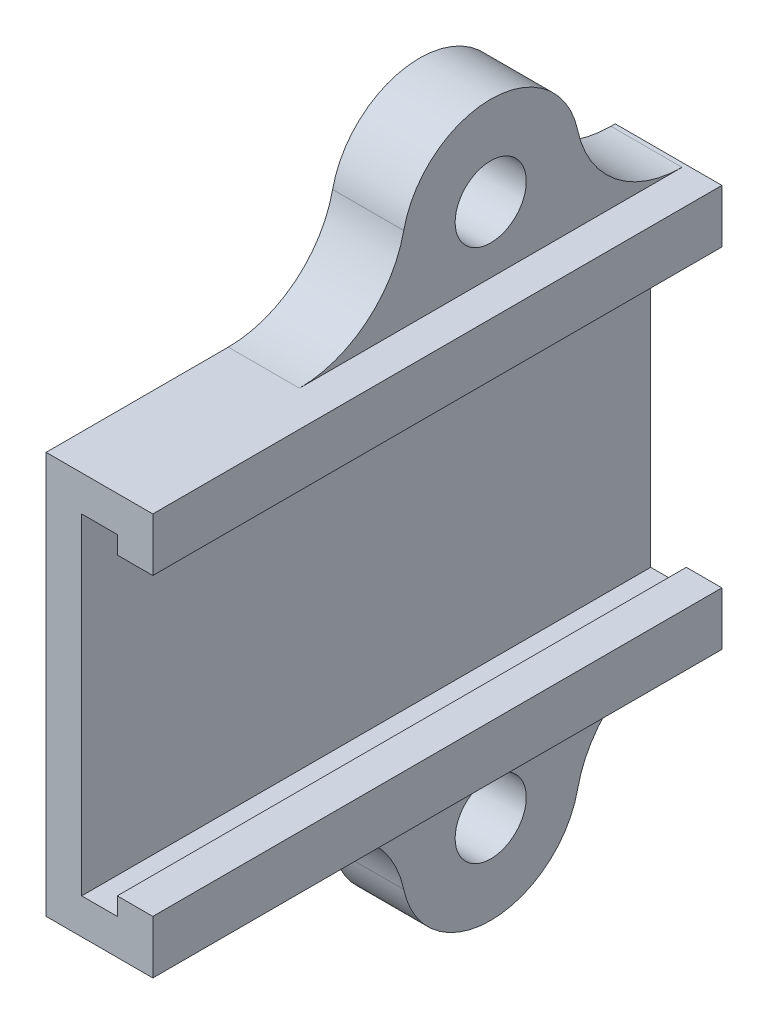
ISO-10303-21;
HEADER;
FILE_DESCRIPTION(('STEP AP214'),'2;1');
FILE_NAME('part.step','',(''),(''),'','','');
FILE_SCHEMA(('AUTOMOTIVE_DESIGN { 1 0 10303 214 1 1 1 1 }'));
ENDSEC;
DATA;
#1=APPLICATION_CONTEXT('core data for automotive mechanical design processes');
#2=APPLICATION_PROTOCOL_DEFINITION('international standard','automotive_design',2000,#1);
#3=PRODUCT_CONTEXT('',#1,'mechanical');
#4=PRODUCT('Part','Part','',(#3));
#5=PRODUCT_RELATED_PRODUCT_CATEGORY('part','',(#4));
#6=PRODUCT_DEFINITION_FORMATION('','',#4);
#7=PRODUCT_DEFINITION_CONTEXT('part definition',#1,'design');
#8=PRODUCT_DEFINITION('design','',#6,#7);
#9=PRODUCT_DEFINITION_SHAPE('','',#8);
#10=(LENGTH_UNIT() NAMED_UNIT(*) SI_UNIT(.MILLI.,.METRE.));
#11=(NAMED_UNIT(*) PLANE_ANGLE_UNIT() SI_UNIT($,.RADIAN.));
#12=(NAMED_UNIT(*) SI_UNIT($,.STERADIAN.) SOLID_ANGLE_UNIT());
#13=UNCERTAINTY_MEASURE_WITH_UNIT(LENGTH_MEASURE(1.E-05),#10,'distance_accuracy_value','');
#14=(GEOMETRIC_REPRESENTATION_CONTEXT(3) GLOBAL_UNCERTAINTY_ASSIGNED_CONTEXT((#13)) GLOBAL_UNIT_ASSIGNED_CONTEXT((#10,
#11,#12)) REPRESENTATION_CONTEXT('',''));
#15=CARTESIAN_POINT('',(0.,0.,0.));
#16=DIRECTION('',(0.,0.,1.));
#17=DIRECTION('',(1.,0.,0.));
#18=AXIS2_PLACEMENT_3D('',#15,#16,#17);
#19=CARTESIAN_POINT('',(-2.,-2.,32.));
#20=DIRECTION('',(0.,1.,0.));
#21=DIRECTION('',(-1.,0.,0.));
#22=AXIS2_PLACEMENT_3D('',#19,#20,#21);
#23=PLANE('',#22);
#24=DIRECTION('',(0.,0.,-1.));
#25=VECTOR('',#24,1.);
#26=CARTESIAN_POINT('',(-2.,-2.,32.));
#27=LINE('',#26,#25);
#28=CARTESIAN_POINT('',(-2.,-2.,32.));
#29=VERTEX_POINT('',#28);
#30=CARTESIAN_POINT('',(-2.,-2.,21.7568582773968));
#31=VERTEX_POINT('',#30);
#32=EDGE_CURVE('E252',#29,#31,#27,.T.);
#33=ORIENTED_EDGE('',*,*,#32,.T.);
#34=DIRECTION('',(-1.,0.,0.));
#35=VECTOR('',#34,1.);
#36=CARTESIAN_POINT('',(-2.,-2.,21.7568582773968));
#37=LINE('',#36,#35);
#38=CARTESIAN_POINT('',(2.,-2.,21.7568582773968));
#39=VERTEX_POINT('',#38);
#40=EDGE_CURVE('E207',#31,#39,#37,.F.);
#41=ORIENTED_EDGE('',*,*,#40,.T.);
#42=DIRECTION('',(0.,0.,-1.));
#43=VECTOR('',#42,1.);
#44=CARTESIAN_POINT('',(2.,-2.,16.));
#45=LINE('',#44,#43);
#46=CARTESIAN_POINT('',(2.,-2.,0.243141722603198));
#47=VERTEX_POINT('',#46);
#48=EDGE_CURVE('E580',#39,#47,#45,.T.);
#49=ORIENTED_EDGE('',*,*,#48,.T.);
#50=DIRECTION('',(-1.,0.,0.));
#51=VECTOR('',#50,1.);
#52=CARTESIAN_POINT('',(-2.,-2.,0.243141722603202));
#53=LINE('',#52,#51);
#54=CARTESIAN_POINT('',(-2.,-2.,0.243141722603202));
#55=VERTEX_POINT('',#54);
#56=EDGE_CURVE('E204',#47,#55,#53,.T.);
#57=ORIENTED_EDGE('',*,*,#56,.T.);
#58=CARTESIAN_POINT('',(-2.,-2.,0.));
#59=VERTEX_POINT('',#58);
#60=EDGE_CURVE('E319',#55,#59,#27,.T.);
#61=ORIENTED_EDGE('',*,*,#60,.T.);
#62=DIRECTION('',(1.,0.,0.));
#63=VECTOR('',#62,1.);
#64=CARTESIAN_POINT('',(-2.,-2.,0.));
#65=LINE('',#64,#63);
#66=CARTESIAN_POINT('',(4.,-2.,0.));
#67=VERTEX_POINT('',#66);
#68=EDGE_CURVE('E297',#59,#67,#65,.T.);
#69=ORIENTED_EDGE('',*,*,#68,.T.);
#70=DIRECTION('',(0.,0.,-1.));
#71=VECTOR('',#70,1.);
#72=CARTESIAN_POINT('',(4.,-2.,32.));
#73=LINE('',#72,#71);
#74=CARTESIAN_POINT('',(4.,-2.,32.));
#75=VERTEX_POINT('',#74);
#76=EDGE_CURVE('E316',#75,#67,#73,.T.);
#77=ORIENTED_EDGE('',*,*,#76,.F.);
#78=DIRECTION('',(1.,0.,0.));
#79=VECTOR('',#78,1.);
#80=CARTESIAN_POINT('',(-2.,-2.,32.));
#81=LINE('',#80,#79);
#82=EDGE_CURVE('E275',#29,#75,#81,.T.);
#83=ORIENTED_EDGE('',*,*,#82,.F.);
#84=EDGE_LOOP('',(#33,#41,#49,#57,#61,#69,#77,#83));
#85=FACE_BOUND('',#84,.T.);
#86=ADVANCED_FACE('F33',(#85),#23,.F.);
#87=CARTESIAN_POINT('',(-2.,20.6,32.));
#88=DIRECTION('',(0.,-1.,0.));
#89=DIRECTION('',(0.,0.,-1.));
#90=AXIS2_PLACEMENT_3D('',#87,#88,#89);
#91=PLANE('',#90);
#92=DIRECTION('',(0.,0.,1.));
#93=VECTOR('',#92,1.);
#94=CARTESIAN_POINT('',(2.,20.6,6.));
#95=LINE('',#94,#93);
#96=CARTESIAN_POINT('',(2.,20.6,0.243141722603202));
#97=VERTEX_POINT('',#96);
#98=CARTESIAN_POINT('',(2.,20.6,21.7568582773968));
#99=VERTEX_POINT('',#98);
#100=EDGE_CURVE('E257',#97,#99,#95,.T.);
#101=ORIENTED_EDGE('',*,*,#100,.T.);
#102=DIRECTION('',(-1.,0.,0.));
#103=VECTOR('',#102,1.);
#104=CARTESIAN_POINT('',(-2.,20.6,21.7568582773968));
#105=LINE('',#104,#103);
#106=CARTESIAN_POINT('',(-2.,20.6,21.7568582773968));
#107=VERTEX_POINT('',#106);
#108=EDGE_CURVE('E213',#99,#107,#105,.T.);
#109=ORIENTED_EDGE('',*,*,#108,.T.);
#110=DIRECTION('',(0.,0.,-1.));
#111=VECTOR('',#110,1.);
#112=CARTESIAN_POINT('',(-2.,20.6,32.));
#113=LINE('',#112,#111);
#114=CARTESIAN_POINT('',(-2.,20.6,32.));
#115=VERTEX_POINT('',#114);
#116=EDGE_CURVE('E251',#115,#107,#113,.T.);
#117=ORIENTED_EDGE('',*,*,#116,.F.);
#118=DIRECTION('',(-1.,0.,0.));
#119=VECTOR('',#118,1.);
#120=CARTESIAN_POINT('',(-2.,20.6,32.));
#121=LINE('',#120,#119);
#122=CARTESIAN_POINT('',(3.99999999999999,20.6,32.));
#123=VERTEX_POINT('',#122);
#124=EDGE_CURVE('E271',#123,#115,#121,.T.);
#125=ORIENTED_EDGE('',*,*,#124,.F.);
#126=DIRECTION('',(0.,0.,-1.));
#127=VECTOR('',#126,1.);
#128=CARTESIAN_POINT('',(3.99999999999999,20.6,32.));
#129=LINE('',#128,#127);
#130=CARTESIAN_POINT('',(3.99999999999999,20.6,0.));
#131=VERTEX_POINT('',#130);
#132=EDGE_CURVE('E323',#123,#131,#129,.T.);
#133=ORIENTED_EDGE('',*,*,#132,.T.);
#134=DIRECTION('',(-1.,0.,0.));
#135=VECTOR('',#134,1.);
#136=CARTESIAN_POINT('',(-2.,20.6,0.));
#137=LINE('',#136,#135);
#138=CARTESIAN_POINT('',(-2.,20.6,0.));
#139=VERTEX_POINT('',#138);
#140=EDGE_CURVE('E249',#131,#139,#137,.T.);
#141=ORIENTED_EDGE('',*,*,#140,.T.);
#142=CARTESIAN_POINT('',(-2.,20.6,0.243141722603202));
#143=VERTEX_POINT('',#142);
#144=EDGE_CURVE('E239',#143,#139,#113,.T.);
#145=ORIENTED_EDGE('',*,*,#144,.F.);
#146=DIRECTION('',(-1.,0.,0.));
#147=VECTOR('',#146,1.);
#148=CARTESIAN_POINT('',(-2.,20.6,0.243141722603202));
#149=LINE('',#148,#147);
#150=EDGE_CURVE('E210',#143,#97,#149,.F.);
#151=ORIENTED_EDGE('',*,*,#150,.T.);
#152=EDGE_LOOP('',(#101,#109,#117,#125,#133,#141,#145,#151));
#153=FACE_BOUND('',#152,.T.);
#154=ADVANCED_FACE('F246',(#153),#91,.F.);
#155=CARTESIAN_POINT('',(0.,0.,32.));
#156=DIRECTION('',(-1.,0.,0.));
#157=DIRECTION('',(0.,0.,1.));
#158=AXIS2_PLACEMENT_3D('',#155,#156,#157);
#159=PLANE('',#158);
#160=DIRECTION('',(0.,1.,0.));
#161=VECTOR('',#160,1.);
#162=CARTESIAN_POINT('',(0.,0.,0.));
#163=LINE('',#162,#161);
#164=CARTESIAN_POINT('',(0.,0.,0.));
#165=VERTEX_POINT('',#164);
#166=CARTESIAN_POINT('',(0.,18.6,0.));
#167=VERTEX_POINT('',#166);
#168=EDGE_CURVE('E193',#165,#167,#163,.T.);
#169=ORIENTED_EDGE('',*,*,#168,.T.);
#170=DIRECTION('',(0.,0.,-1.));
#171=VECTOR('',#170,1.);
#172=CARTESIAN_POINT('',(0.,18.6,32.));
#173=LINE('',#172,#171);
#174=CARTESIAN_POINT('',(0.,18.6,32.));
#175=VERTEX_POINT('',#174);
#176=EDGE_CURVE('E173',#175,#167,#173,.T.);
#177=ORIENTED_EDGE('',*,*,#176,.F.);
#178=DIRECTION('',(0.,1.,0.));
#179=VECTOR('',#178,1.);
#180=CARTESIAN_POINT('',(0.,0.,32.));
#181=LINE('',#180,#179);
#182=CARTESIAN_POINT('',(0.,0.,32.));
#183=VERTEX_POINT('',#182);
#184=EDGE_CURVE('E180',#183,#175,#181,.T.);
#185=ORIENTED_EDGE('',*,*,#184,.F.);
#186=DIRECTION('',(0.,0.,-1.));
#187=VECTOR('',#186,1.);
#188=CARTESIAN_POINT('',(0.,0.,32.));
#189=LINE('',#188,#187);
#190=EDGE_CURVE('E284',#183,#165,#189,.T.);
#191=ORIENTED_EDGE('',*,*,#190,.T.);
#192=EDGE_LOOP('',(#169,#177,#185,#191));
#193=FACE_BOUND('',#192,.T.);
#194=ADVANCED_FACE('F191',(#193),#159,.F.);
#195=CARTESIAN_POINT('',(0.,18.6,32.));
#196=DIRECTION('',(0.,1.,0.));
#197=DIRECTION('',(0.,0.,1.));
#198=AXIS2_PLACEMENT_3D('',#195,#196,#197);
#199=PLANE('',#198);
#200=DIRECTION('',(1.,0.,0.));
#201=VECTOR('',#200,1.);
#202=CARTESIAN_POINT('',(0.,18.6,0.));
#203=LINE('',#202,#201);
#204=CARTESIAN_POINT('',(2.,18.6,0.));
#205=VERTEX_POINT('',#204);
#206=EDGE_CURVE('E286',#167,#205,#203,.T.);
#207=ORIENTED_EDGE('',*,*,#206,.T.);
#208=DIRECTION('',(0.,0.,-1.));
#209=VECTOR('',#208,1.);
#210=CARTESIAN_POINT('',(2.,18.6,32.));
#211=LINE('',#210,#209);
#212=CARTESIAN_POINT('',(2.,18.6,32.));
#213=VERTEX_POINT('',#212);
#214=EDGE_CURVE('E176',#213,#205,#211,.T.);
#215=ORIENTED_EDGE('',*,*,#214,.F.);
#216=DIRECTION('',(1.,0.,0.));
#217=VECTOR('',#216,1.);
#218=CARTESIAN_POINT('',(0.,18.6,32.));
#219=LINE('',#218,#217);
#220=EDGE_CURVE('E169',#175,#213,#219,.T.);
#221=ORIENTED_EDGE('',*,*,#220,.F.);
#222=ORIENTED_EDGE('',*,*,#176,.T.);
#223=EDGE_LOOP('',(#207,#215,#221,#222));
#224=FACE_BOUND('',#223,.T.);
#225=ADVANCED_FACE('F171',(#224),#199,.F.);
#226=CARTESIAN_POINT('',(2.,18.6,32.));
#227=DIRECTION('',(1.,0.,0.));
#228=DIRECTION('',(0.,0.,-1.));
#229=AXIS2_PLACEMENT_3D('',#226,#227,#228);
#230=PLANE('',#229);
#231=DIRECTION('',(0.,-1.,0.));
#232=VECTOR('',#231,1.);
#233=CARTESIAN_POINT('',(2.,18.6,0.));
#234=LINE('',#233,#232);
#235=CARTESIAN_POINT('',(2.,17.6,0.));
#236=VERTEX_POINT('',#235);
#237=EDGE_CURVE('E288',#205,#236,#234,.T.);
#238=ORIENTED_EDGE('',*,*,#237,.T.);
#239=DIRECTION('',(0.,0.,-1.));
#240=VECTOR('',#239,1.);
#241=CARTESIAN_POINT('',(2.,17.6,32.));
#242=LINE('',#241,#240);
#243=CARTESIAN_POINT('',(2.,17.6,32.));
#244=VERTEX_POINT('',#243);
#245=EDGE_CURVE('E198',#244,#236,#242,.T.);
#246=ORIENTED_EDGE('',*,*,#245,.F.);
#247=DIRECTION('',(0.,-1.,0.));
#248=VECTOR('',#247,1.);
#249=CARTESIAN_POINT('',(2.,18.6,32.));
#250=LINE('',#249,#248);
#251=EDGE_CURVE('E179',#213,#244,#250,.T.);
#252=ORIENTED_EDGE('',*,*,#251,.F.);
#253=ORIENTED_EDGE('',*,*,#214,.T.);
#254=EDGE_LOOP('',(#238,#246,#252,#253));
#255=FACE_BOUND('',#254,.T.);
#256=ADVANCED_FACE('F347',(#255),#230,.F.);
#257=CARTESIAN_POINT('',(2.,17.6,32.));
#258=DIRECTION('',(0.,1.,0.));
#259=DIRECTION('',(0.,0.,1.));
#260=AXIS2_PLACEMENT_3D('',#257,#258,#259);
#261=PLANE('',#260);
#262=DIRECTION('',(1.,0.,0.));
#263=VECTOR('',#262,1.);
#264=CARTESIAN_POINT('',(2.,17.6,0.));
#265=LINE('',#264,#263);
#266=CARTESIAN_POINT('',(4.,17.6,0.));
#267=VERTEX_POINT('',#266);
#268=EDGE_CURVE('E290',#236,#267,#265,.T.);
#269=ORIENTED_EDGE('',*,*,#268,.T.);
#270=DIRECTION('',(0.,0.,-1.));
#271=VECTOR('',#270,1.);
#272=CARTESIAN_POINT('',(4.,17.6,32.));
#273=LINE('',#272,#271);
#274=CARTESIAN_POINT('',(4.,17.6,32.));
#275=VERTEX_POINT('',#274);
#276=EDGE_CURVE('E325',#275,#267,#273,.T.);
#277=ORIENTED_EDGE('',*,*,#276,.F.);
#278=DIRECTION('',(1.,0.,0.));
#279=VECTOR('',#278,1.);
#280=CARTESIAN_POINT('',(2.,17.6,32.));
#281=LINE('',#280,#279);
#282=EDGE_CURVE('E267',#244,#275,#281,.T.);
#283=ORIENTED_EDGE('',*,*,#282,.F.);
#284=ORIENTED_EDGE('',*,*,#245,.T.);
#285=EDGE_LOOP('',(#269,#277,#283,#284));
#286=FACE_BOUND('',#285,.T.);
#287=ADVANCED_FACE('F332',(#286),#261,.F.);
#288=CARTESIAN_POINT('',(4.,17.6,32.));
#289=DIRECTION('',(-1.,0.,0.));
#290=DIRECTION('',(0.,-1.,0.));
#291=AXIS2_PLACEMENT_3D('',#288,#289,#290);
#292=PLANE('',#291);
#293=DIRECTION('',(0.,1.,0.));
#294=VECTOR('',#293,1.);
#295=CARTESIAN_POINT('',(4.,17.6,0.));
#296=LINE('',#295,#294);
#297=EDGE_CURVE('E292',#267,#131,#296,.T.);
#298=ORIENTED_EDGE('',*,*,#297,.T.);
#299=ORIENTED_EDGE('',*,*,#132,.F.);
#300=DIRECTION('',(0.,1.,0.));
#301=VECTOR('',#300,1.);
#302=CARTESIAN_POINT('',(4.,17.6,32.));
#303=LINE('',#302,#301);
#304=EDGE_CURVE('E269',#275,#123,#303,.T.);
#305=ORIENTED_EDGE('',*,*,#304,.F.);
#306=ORIENTED_EDGE('',*,*,#276,.T.);
#307=EDGE_LOOP('',(#298,#299,#305,#306));
#308=FACE_BOUND('',#307,.T.);
#309=ADVANCED_FACE('F341',(#308),#292,.F.);
#310=CARTESIAN_POINT('',(-2.,-2.,32.));
#311=DIRECTION('',(1.,0.,0.));
#312=DIRECTION('',(0.,0.,-1.));
#313=AXIS2_PLACEMENT_3D('',#310,#311,#312);
#314=PLANE('',#313);
#315=DIRECTION('',(0.,-1.,0.));
#316=VECTOR('',#315,1.);
#317=CARTESIAN_POINT('',(-2.,-2.,0.));
#318=LINE('',#317,#316);
#319=EDGE_CURVE('E295',#139,#59,#318,.T.);
#320=ORIENTED_EDGE('',*,*,#319,.T.);
#321=ORIENTED_EDGE('',*,*,#60,.F.);
#322=CARTESIAN_POINT('',(-2.,-8.,0.243141722603198));
#323=DIRECTION('',(1.,0.,0.));
#324=DIRECTION('',(0.,0.,-1.));
#325=AXIS2_PLACEMENT_3D('',#322,#323,#324);
#326=CIRCLE('',#325,6.);
#327=CARTESIAN_POINT('',(-2.,-6.74545454545455,6.11051896481964));
#328=VERTEX_POINT('',#327);
#329=EDGE_CURVE('E229',#55,#328,#326,.T.);
#330=ORIENTED_EDGE('',*,*,#329,.T.);
#331=CARTESIAN_POINT('',(-2.,-5.7,11.));
#332=DIRECTION('',(-1.,0.,0.));
#333=DIRECTION('',(0.,0.,1.));
#334=AXIS2_PLACEMENT_3D('',#331,#332,#333);
#335=CIRCLE('',#334,5.);
#336=CARTESIAN_POINT('',(-2.,-6.74545454545455,15.8894810351804));
#337=VERTEX_POINT('',#336);
#338=EDGE_CURVE('E585',#328,#337,#335,.T.);
#339=ORIENTED_EDGE('',*,*,#338,.T.);
#340=CARTESIAN_POINT('',(-2.,-8.,21.7568582773968));
#341=DIRECTION('',(1.,0.,0.));
#342=DIRECTION('',(0.,0.,-1.));
#343=AXIS2_PLACEMENT_3D('',#340,#341,#342);
#344=CIRCLE('',#343,6.);
#345=EDGE_CURVE('E220',#337,#31,#344,.T.);
#346=ORIENTED_EDGE('',*,*,#345,.T.);
#347=ORIENTED_EDGE('',*,*,#32,.F.);
#348=DIRECTION('',(0.,-1.,0.));
#349=VECTOR('',#348,1.);
#350=CARTESIAN_POINT('',(-2.,-2.,32.));
#351=LINE('',#350,#349);
#352=EDGE_CURVE('E273',#115,#29,#351,.T.);
#353=ORIENTED_EDGE('',*,*,#352,.F.);
#354=ORIENTED_EDGE('',*,*,#116,.T.);
#355=CARTESIAN_POINT('',(-2.,26.6,21.7568582773968));
#356=DIRECTION('',(1.,0.,0.));
#357=DIRECTION('',(0.,0.,-1.));
#358=AXIS2_PLACEMENT_3D('',#355,#356,#357);
#359=CIRCLE('',#358,6.);
#360=CARTESIAN_POINT('',(-2.,25.3454545454545,15.8894810351804));
#361=VERTEX_POINT('',#360);
#362=EDGE_CURVE('E224',#107,#361,#359,.T.);
#363=ORIENTED_EDGE('',*,*,#362,.T.);
#364=CARTESIAN_POINT('',(-2.,24.3,11.));
#365=DIRECTION('',(-1.,0.,0.));
#366=DIRECTION('',(0.,0.,-1.));
#367=AXIS2_PLACEMENT_3D('',#364,#365,#366);
#368=CIRCLE('',#367,5.);
#369=CARTESIAN_POINT('',(-2.,25.3454545454545,6.11051896481964));
#370=VERTEX_POINT('',#369);
#371=EDGE_CURVE('E241',#361,#370,#368,.T.);
#372=ORIENTED_EDGE('',*,*,#371,.T.);
#373=CARTESIAN_POINT('',(-2.,26.6,0.243141722603202));
#374=DIRECTION('',(1.,0.,0.));
#375=DIRECTION('',(0.,0.,-1.));
#376=AXIS2_PLACEMENT_3D('',#373,#374,#375);
#377=CIRCLE('',#376,6.);
#378=EDGE_CURVE('E41',#370,#143,#377,.T.);
#379=ORIENTED_EDGE('',*,*,#378,.T.);
#380=ORIENTED_EDGE('',*,*,#144,.T.);
#381=EDGE_LOOP('',(#320,#321,#330,#339,#346,#347,#353,#354,#363,#372,#379,#380));
#382=FACE_BOUND('',#381,.T.);
#383=CARTESIAN_POINT('',(-2.,24.3,11.));
#384=DIRECTION('',(-1.,0.,0.));
#385=DIRECTION('',(0.,0.,1.));
#386=AXIS2_PLACEMENT_3D('',#383,#384,#385);
#387=CIRCLE('',#386,2.);
#388=CARTESIAN_POINT('',(-2.,24.3,13.));
#389=VERTEX_POINT('',#388);
#390=EDGE_CURVE('E263',#389,#389,#387,.T.);
#391=ORIENTED_EDGE('',*,*,#390,.F.);
#392=EDGE_LOOP('',(#391));
#393=FACE_BOUND('',#392,.T.);
#394=CARTESIAN_POINT('',(-2.,-5.7,11.));
#395=DIRECTION('',(-1.,0.,0.));
#396=DIRECTION('',(0.,0.,1.));
#397=AXIS2_PLACEMENT_3D('',#394,#395,#396);
#398=CIRCLE('',#397,2.);
#399=CARTESIAN_POINT('',(-2.,-5.7,13.));
#400=VERTEX_POINT('',#399);
#401=EDGE_CURVE('E592',#400,#400,#398,.T.);
#402=ORIENTED_EDGE('',*,*,#401,.F.);
#403=EDGE_LOOP('',(#402));
#404=FACE_BOUND('',#403,.T.);
#405=ADVANCED_FACE('F237',(#382,#393,#404),#314,.F.);
#406=CARTESIAN_POINT('',(4.,-2.,32.));
#407=DIRECTION('',(-1.,0.,0.));
#408=DIRECTION('',(0.,-1.,0.));
#409=AXIS2_PLACEMENT_3D('',#406,#407,#408);
#410=PLANE('',#409);
#411=DIRECTION('',(0.,1.,0.));
#412=VECTOR('',#411,1.);
#413=CARTESIAN_POINT('',(4.,-2.,0.));
#414=LINE('',#413,#412);
#415=CARTESIAN_POINT('',(4.,1.,0.));
#416=VERTEX_POINT('',#415);
#417=EDGE_CURVE('E299',#67,#416,#414,.T.);
#418=ORIENTED_EDGE('',*,*,#417,.T.);
#419=DIRECTION('',(0.,0.,-1.));
#420=VECTOR('',#419,1.);
#421=CARTESIAN_POINT('',(4.,1.,32.));
#422=LINE('',#421,#420);
#423=CARTESIAN_POINT('',(4.,1.,32.));
#424=VERTEX_POINT('',#423);
#425=EDGE_CURVE('E313',#424,#416,#422,.T.);
#426=ORIENTED_EDGE('',*,*,#425,.F.);
#427=DIRECTION('',(0.,1.,0.));
#428=VECTOR('',#427,1.);
#429=CARTESIAN_POINT('',(4.,-2.,32.));
#430=LINE('',#429,#428);
#431=EDGE_CURVE('E277',#75,#424,#430,.T.);
#432=ORIENTED_EDGE('',*,*,#431,.F.);
#433=ORIENTED_EDGE('',*,*,#76,.T.);
#434=EDGE_LOOP('',(#418,#426,#432,#433));
#435=FACE_BOUND('',#434,.T.);
#436=ADVANCED_FACE('F365',(#435),#410,.F.);
#437=CARTESIAN_POINT('',(4.,1.,32.));
#438=DIRECTION('',(0.,-1.,0.));
#439=DIRECTION('',(1.,0.,0.));
#440=AXIS2_PLACEMENT_3D('',#437,#438,#439);
#441=PLANE('',#440);
#442=DIRECTION('',(-1.,0.,0.));
#443=VECTOR('',#442,1.);
#444=CARTESIAN_POINT('',(4.,1.,0.));
#445=LINE('',#444,#443);
#446=CARTESIAN_POINT('',(2.,1.,0.));
#447=VERTEX_POINT('',#446);
#448=EDGE_CURVE('E301',#416,#447,#445,.T.);
#449=ORIENTED_EDGE('',*,*,#448,.T.);
#450=DIRECTION('',(0.,0.,-1.));
#451=VECTOR('',#450,1.);
#452=CARTESIAN_POINT('',(2.,1.,32.));
#453=LINE('',#452,#451);
#454=CARTESIAN_POINT('',(2.,1.,32.));
#455=VERTEX_POINT('',#454);
#456=EDGE_CURVE('E310',#455,#447,#453,.T.);
#457=ORIENTED_EDGE('',*,*,#456,.F.);
#458=DIRECTION('',(-1.,0.,0.));
#459=VECTOR('',#458,1.);
#460=CARTESIAN_POINT('',(4.,1.,32.));
#461=LINE('',#460,#459);
#462=EDGE_CURVE('E279',#424,#455,#461,.T.);
#463=ORIENTED_EDGE('',*,*,#462,.F.);
#464=ORIENTED_EDGE('',*,*,#425,.T.);
#465=EDGE_LOOP('',(#449,#457,#463,#464));
#466=FACE_BOUND('',#465,.T.);
#467=ADVANCED_FACE('F386',(#466),#441,.F.);
#468=CARTESIAN_POINT('',(2.,1.,32.));
#469=DIRECTION('',(1.,0.,0.));
#470=DIRECTION('',(0.,0.,-1.));
#471=AXIS2_PLACEMENT_3D('',#468,#469,#470);
#472=PLANE('',#471);
#473=DIRECTION('',(0.,-1.,0.));
#474=VECTOR('',#473,1.);
#475=CARTESIAN_POINT('',(2.,1.,0.));
#476=LINE('',#475,#474);
#477=CARTESIAN_POINT('',(2.,0.,0.));
#478=VERTEX_POINT('',#477);
#479=EDGE_CURVE('E303',#447,#478,#476,.T.);
#480=ORIENTED_EDGE('',*,*,#479,.T.);
#481=DIRECTION('',(0.,0.,-1.));
#482=VECTOR('',#481,1.);
#483=CARTESIAN_POINT('',(2.,0.,32.));
#484=LINE('',#483,#482);
#485=CARTESIAN_POINT('',(2.,0.,32.));
#486=VERTEX_POINT('',#485);
#487=EDGE_CURVE('E307',#486,#478,#484,.T.);
#488=ORIENTED_EDGE('',*,*,#487,.F.);
#489=DIRECTION('',(0.,-1.,0.));
#490=VECTOR('',#489,1.);
#491=CARTESIAN_POINT('',(2.,1.,32.));
#492=LINE('',#491,#490);
#493=EDGE_CURVE('E281',#455,#486,#492,.T.);
#494=ORIENTED_EDGE('',*,*,#493,.F.);
#495=ORIENTED_EDGE('',*,*,#456,.T.);
#496=EDGE_LOOP('',(#480,#488,#494,#495));
#497=FACE_BOUND('',#496,.T.);
#498=ADVANCED_FACE('F393',(#497),#472,.F.);
#499=CARTESIAN_POINT('',(0.,0.,32.));
#500=DIRECTION('',(0.,-1.,0.));
#501=DIRECTION('',(0.,0.,-1.));
#502=AXIS2_PLACEMENT_3D('',#499,#500,#501);
#503=PLANE('',#502);
#504=DIRECTION('',(-1.,0.,0.));
#505=VECTOR('',#504,1.);
#506=CARTESIAN_POINT('',(0.,0.,0.));
#507=LINE('',#506,#505);
#508=EDGE_CURVE('E189',#478,#165,#507,.T.);
#509=ORIENTED_EDGE('',*,*,#508,.T.);
#510=ORIENTED_EDGE('',*,*,#190,.F.);
#511=DIRECTION('',(-1.,0.,0.));
#512=VECTOR('',#511,1.);
#513=CARTESIAN_POINT('',(0.,0.,32.));
#514=LINE('',#513,#512);
#515=EDGE_CURVE('E185',#486,#183,#514,.T.);
#516=ORIENTED_EDGE('',*,*,#515,.F.);
#517=ORIENTED_EDGE('',*,*,#487,.T.);
#518=EDGE_LOOP('',(#509,#510,#516,#517));
#519=FACE_BOUND('',#518,.T.);
#520=ADVANCED_FACE('F400',(#519),#503,.F.);
#521=CARTESIAN_POINT('',(0.,0.,32.));
#522=DIRECTION('',(0.,0.,-1.));
#523=DIRECTION('',(-1.,0.,0.));
#524=AXIS2_PLACEMENT_3D('',#521,#522,#523);
#525=PLANE('',#524);
#526=ORIENTED_EDGE('',*,*,#184,.T.);
#527=ORIENTED_EDGE('',*,*,#220,.T.);
#528=ORIENTED_EDGE('',*,*,#251,.T.);
#529=ORIENTED_EDGE('',*,*,#282,.T.);
#530=ORIENTED_EDGE('',*,*,#304,.T.);
#531=ORIENTED_EDGE('',*,*,#124,.T.);
#532=ORIENTED_EDGE('',*,*,#352,.T.);
#533=ORIENTED_EDGE('',*,*,#82,.T.);
#534=ORIENTED_EDGE('',*,*,#431,.T.);
#535=ORIENTED_EDGE('',*,*,#462,.T.);
#536=ORIENTED_EDGE('',*,*,#493,.T.);
#537=ORIENTED_EDGE('',*,*,#515,.T.);
#538=EDGE_LOOP('',(#526,#527,#528,#529,#530,#531,#532,#533,#534,#535,#536,#537));
#539=FACE_BOUND('',#538,.T.);
#540=ADVANCED_FACE('F183',(#539),#525,.F.);
#541=CARTESIAN_POINT('',(0.,0.,0.));
#542=DIRECTION('',(0.,0.,-1.));
#543=DIRECTION('',(-1.,0.,0.));
#544=AXIS2_PLACEMENT_3D('',#541,#542,#543);
#545=PLANE('',#544);
#546=ORIENTED_EDGE('',*,*,#168,.F.);
#547=ORIENTED_EDGE('',*,*,#508,.F.);
#548=ORIENTED_EDGE('',*,*,#479,.F.);
#549=ORIENTED_EDGE('',*,*,#448,.F.);
#550=ORIENTED_EDGE('',*,*,#417,.F.);
#551=ORIENTED_EDGE('',*,*,#68,.F.);
#552=ORIENTED_EDGE('',*,*,#319,.F.);
#553=ORIENTED_EDGE('',*,*,#140,.F.);
#554=ORIENTED_EDGE('',*,*,#297,.F.);
#555=ORIENTED_EDGE('',*,*,#268,.F.);
#556=ORIENTED_EDGE('',*,*,#237,.F.);
#557=ORIENTED_EDGE('',*,*,#206,.F.);
#558=EDGE_LOOP('',(#546,#547,#548,#549,#550,#551,#552,#553,#554,#555,#556,#557));
#559=FACE_BOUND('',#558,.T.);
#560=ADVANCED_FACE('F338',(#559),#545,.T.);
#561=CARTESIAN_POINT('',(2.,24.3,11.));
#562=DIRECTION('',(-1.,0.,0.));
#563=DIRECTION('',(0.,0.,1.));
#564=AXIS2_PLACEMENT_3D('',#561,#562,#563);
#565=CYLINDRICAL_SURFACE('',#564,5.);
#566=ORIENTED_EDGE('',*,*,#371,.F.);
#567=DIRECTION('',(-1.,0.,0.));
#568=VECTOR('',#567,1.);
#569=CARTESIAN_POINT('',(2.,25.3454545454545,15.8894810351804));
#570=LINE('',#569,#568);
#571=CARTESIAN_POINT('',(2.,25.3454545454545,15.8894810351804));
#572=VERTEX_POINT('',#571);
#573=EDGE_CURVE('E53',#361,#572,#570,.F.);
#574=ORIENTED_EDGE('',*,*,#573,.T.);
#575=CARTESIAN_POINT('',(2.,24.3,11.));
#576=DIRECTION('',(-1.,0.,0.));
#577=DIRECTION('',(0.,0.,-1.));
#578=AXIS2_PLACEMENT_3D('',#575,#576,#577);
#579=CIRCLE('',#578,5.);
#580=CARTESIAN_POINT('',(2.,25.3454545454545,6.11051896481964));
#581=VERTEX_POINT('',#580);
#582=EDGE_CURVE('E255',#572,#581,#579,.T.);
#583=ORIENTED_EDGE('',*,*,#582,.T.);
#584=DIRECTION('',(-1.,0.,0.));
#585=VECTOR('',#584,1.);
#586=CARTESIAN_POINT('',(2.,25.3454545454545,6.11051896481964));
#587=LINE('',#586,#585);
#588=EDGE_CURVE('E216',#581,#370,#587,.T.);
#589=ORIENTED_EDGE('',*,*,#588,.T.);
#590=EDGE_LOOP('',(#566,#574,#583,#589));
#591=FACE_BOUND('',#590,.T.);
#592=ADVANCED_FACE('F254',(#591),#565,.T.);
#593=CARTESIAN_POINT('',(2.,24.3,11.));
#594=DIRECTION('',(1.,0.,0.));
#595=DIRECTION('',(0.,0.,-1.));
#596=AXIS2_PLACEMENT_3D('',#593,#594,#595);
#597=PLANE('',#596);
#598=CARTESIAN_POINT('',(2.,24.3,11.));
#599=DIRECTION('',(-1.,0.,0.));
#600=DIRECTION('',(0.,0.,1.));
#601=AXIS2_PLACEMENT_3D('',#598,#599,#600);
#602=CIRCLE('',#601,2.);
#603=CARTESIAN_POINT('',(2.,24.3,13.));
#604=VERTEX_POINT('',#603);
#605=EDGE_CURVE('E260',#604,#604,#602,.T.);
#606=ORIENTED_EDGE('',*,*,#605,.T.);
#607=EDGE_LOOP('',(#606));
#608=FACE_BOUND('',#607,.T.);
#609=ORIENTED_EDGE('',*,*,#582,.F.);
#610=CARTESIAN_POINT('',(2.,26.6,21.7568582773968));
#611=DIRECTION('',(1.,0.,0.));
#612=DIRECTION('',(0.,0.,-1.));
#613=AXIS2_PLACEMENT_3D('',#610,#611,#612);
#614=CIRCLE('',#613,6.);
#615=EDGE_CURVE('E226',#572,#99,#614,.F.);
#616=ORIENTED_EDGE('',*,*,#615,.T.);
#617=ORIENTED_EDGE('',*,*,#100,.F.);
#618=CARTESIAN_POINT('',(2.,26.6,0.243141722603202));
#619=DIRECTION('',(1.,0.,0.));
#620=DIRECTION('',(0.,0.,-1.));
#621=AXIS2_PLACEMENT_3D('',#618,#619,#620);
#622=CIRCLE('',#621,6.);
#623=EDGE_CURVE('E11',#97,#581,#622,.F.);
#624=ORIENTED_EDGE('',*,*,#623,.T.);
#625=EDGE_LOOP('',(#609,#616,#617,#624));
#626=FACE_BOUND('',#625,.T.);
#627=ADVANCED_FACE('F427',(#608,#626),#597,.T.);
#628=CARTESIAN_POINT('',(2.,24.3,11.));
#629=DIRECTION('',(-1.,0.,0.));
#630=DIRECTION('',(0.,0.,1.));
#631=AXIS2_PLACEMENT_3D('',#628,#629,#630);
#632=CYLINDRICAL_SURFACE('',#631,2.);
#633=ORIENTED_EDGE('',*,*,#605,.F.);
#634=EDGE_LOOP('',(#633));
#635=FACE_BOUND('',#634,.T.);
#636=ORIENTED_EDGE('',*,*,#390,.T.);
#637=EDGE_LOOP('',(#636));
#638=FACE_BOUND('',#637,.T.);
#639=ADVANCED_FACE('F434',(#635,#638),#632,.F.);
#640=CARTESIAN_POINT('',(2.,-5.7,11.));
#641=DIRECTION('',(-1.,0.,0.));
#642=DIRECTION('',(0.,0.,1.));
#643=AXIS2_PLACEMENT_3D('',#640,#641,#642);
#644=CYLINDRICAL_SURFACE('',#643,5.);
#645=CARTESIAN_POINT('',(2.,-5.7,11.));
#646=DIRECTION('',(-1.,0.,0.));
#647=DIRECTION('',(0.,0.,1.));
#648=AXIS2_PLACEMENT_3D('',#645,#646,#647);
#649=CIRCLE('',#648,5.);
#650=CARTESIAN_POINT('',(2.,-6.74545454545455,6.11051896481964));
#651=VERTEX_POINT('',#650);
#652=CARTESIAN_POINT('',(2.,-6.74545454545455,15.8894810351804));
#653=VERTEX_POINT('',#652);
#654=EDGE_CURVE('E582',#651,#653,#649,.T.);
#655=ORIENTED_EDGE('',*,*,#654,.T.);
#656=DIRECTION('',(-1.,0.,0.));
#657=VECTOR('',#656,1.);
#658=CARTESIAN_POINT('',(2.,-6.74545454545455,15.8894810351804));
#659=LINE('',#658,#657);
#660=EDGE_CURVE('E196',#653,#337,#659,.T.);
#661=ORIENTED_EDGE('',*,*,#660,.T.);
#662=ORIENTED_EDGE('',*,*,#338,.F.);
#663=DIRECTION('',(-1.,0.,0.));
#664=VECTOR('',#663,1.);
#665=CARTESIAN_POINT('',(2.,-6.74545454545455,6.11051896481963));
#666=LINE('',#665,#664);
#667=EDGE_CURVE('E194',#328,#651,#666,.F.);
#668=ORIENTED_EDGE('',*,*,#667,.T.);
#669=EDGE_LOOP('',(#655,#661,#662,#668));
#670=FACE_BOUND('',#669,.T.);
#671=ADVANCED_FACE('F442',(#670),#644,.T.);
#672=CARTESIAN_POINT('',(2.,-5.7,11.));
#673=DIRECTION('',(-1.,0.,0.));
#674=DIRECTION('',(0.,0.,1.));
#675=AXIS2_PLACEMENT_3D('',#672,#673,#674);
#676=PLANE('',#675);
#677=CARTESIAN_POINT('',(2.,-5.7,11.));
#678=DIRECTION('',(-1.,0.,0.));
#679=DIRECTION('',(0.,0.,1.));
#680=AXIS2_PLACEMENT_3D('',#677,#678,#679);
#681=CIRCLE('',#680,2.);
#682=CARTESIAN_POINT('',(2.,-5.7,13.));
#683=VERTEX_POINT('',#682);
#684=EDGE_CURVE('E589',#683,#683,#681,.T.);
#685=ORIENTED_EDGE('',*,*,#684,.T.);
#686=EDGE_LOOP('',(#685));
#687=FACE_BOUND('',#686,.T.);
#688=ORIENTED_EDGE('',*,*,#654,.F.);
#689=CARTESIAN_POINT('',(2.,-8.,0.243141722603198));
#690=DIRECTION('',(-1.,0.,0.));
#691=DIRECTION('',(0.,0.,1.));
#692=AXIS2_PLACEMENT_3D('',#689,#690,#691);
#693=CIRCLE('',#692,6.);
#694=EDGE_CURVE('E231',#651,#47,#693,.T.);
#695=ORIENTED_EDGE('',*,*,#694,.T.);
#696=ORIENTED_EDGE('',*,*,#48,.F.);
#697=CARTESIAN_POINT('',(2.,-8.,21.7568582773968));
#698=DIRECTION('',(-1.,0.,0.));
#699=DIRECTION('',(0.,0.,1.));
#700=AXIS2_PLACEMENT_3D('',#697,#698,#699);
#701=CIRCLE('',#700,6.);
#702=EDGE_CURVE('E222',#39,#653,#701,.T.);
#703=ORIENTED_EDGE('',*,*,#702,.T.);
#704=EDGE_LOOP('',(#688,#695,#696,#703));
#705=FACE_BOUND('',#704,.T.);
#706=ADVANCED_FACE('F450',(#687,#705),#676,.F.);
#707=CARTESIAN_POINT('',(2.,-5.7,11.));
#708=DIRECTION('',(-1.,0.,0.));
#709=DIRECTION('',(0.,0.,1.));
#710=AXIS2_PLACEMENT_3D('',#707,#708,#709);
#711=CYLINDRICAL_SURFACE('',#710,2.);
#712=ORIENTED_EDGE('',*,*,#684,.F.);
#713=EDGE_LOOP('',(#712));
#714=FACE_BOUND('',#713,.T.);
#715=ORIENTED_EDGE('',*,*,#401,.T.);
#716=EDGE_LOOP('',(#715));
#717=FACE_BOUND('',#716,.T.);
#718=ADVANCED_FACE('F458',(#714,#717),#711,.F.);
#719=CARTESIAN_POINT('',(2.,-8.,21.7568582773968));
#720=DIRECTION('',(-1.,0.,0.));
#721=DIRECTION('',(0.,0.,1.));
#722=AXIS2_PLACEMENT_3D('',#719,#720,#721);
#723=CYLINDRICAL_SURFACE('',#722,6.);
#724=ORIENTED_EDGE('',*,*,#702,.F.);
#725=ORIENTED_EDGE('',*,*,#40,.F.);
#726=ORIENTED_EDGE('',*,*,#345,.F.);
#727=ORIENTED_EDGE('',*,*,#660,.F.);
#728=EDGE_LOOP('',(#724,#725,#726,#727));
#729=FACE_BOUND('',#728,.T.);
#730=ADVANCED_FACE('F466',(#729),#723,.F.);
#731=CARTESIAN_POINT('',(2.,26.6,21.7568582773968));
#732=DIRECTION('',(-1.,0.,0.));
#733=DIRECTION('',(0.,0.,1.));
#734=AXIS2_PLACEMENT_3D('',#731,#732,#733);
#735=CYLINDRICAL_SURFACE('',#734,6.);
#736=ORIENTED_EDGE('',*,*,#615,.F.);
#737=ORIENTED_EDGE('',*,*,#573,.F.);
#738=ORIENTED_EDGE('',*,*,#362,.F.);
#739=ORIENTED_EDGE('',*,*,#108,.F.);
#740=EDGE_LOOP('',(#736,#737,#738,#739));
#741=FACE_BOUND('',#740,.T.);
#742=ADVANCED_FACE('F473',(#741),#735,.F.);
#743=CARTESIAN_POINT('',(2.,-8.,0.243141722603198));
#744=DIRECTION('',(-1.,0.,0.));
#745=DIRECTION('',(0.,0.,1.));
#746=AXIS2_PLACEMENT_3D('',#743,#744,#745);
#747=CYLINDRICAL_SURFACE('',#746,6.);
#748=ORIENTED_EDGE('',*,*,#694,.F.);
#749=ORIENTED_EDGE('',*,*,#667,.F.);
#750=ORIENTED_EDGE('',*,*,#329,.F.);
#751=ORIENTED_EDGE('',*,*,#56,.F.);
#752=EDGE_LOOP('',(#748,#749,#750,#751));
#753=FACE_BOUND('',#752,.T.);
#754=ADVANCED_FACE('F481',(#753),#747,.F.);
#755=CARTESIAN_POINT('',(2.,26.6,0.243141722603202));
#756=DIRECTION('',(-1.,0.,0.));
#757=DIRECTION('',(0.,0.,1.));
#758=AXIS2_PLACEMENT_3D('',#755,#756,#757);
#759=CYLINDRICAL_SURFACE('',#758,6.);
#760=ORIENTED_EDGE('',*,*,#623,.F.);
#761=ORIENTED_EDGE('',*,*,#150,.F.);
#762=ORIENTED_EDGE('',*,*,#378,.F.);
#763=ORIENTED_EDGE('',*,*,#588,.F.);
#764=EDGE_LOOP('',(#760,#761,#762,#763));
#765=FACE_BOUND('',#764,.T.);
#766=ADVANCED_FACE('F35',(#765),#759,.F.);
#767=CLOSED_SHELL('',(#86,#154,#194,#225,#256,#287,#309,#405,#436,#467,#498,#520,#540,#560,#592,
#627,#639,#671,#706,#718,#730,#742,#754,#766));
#768=MANIFOLD_SOLID_BREP('B2',#767);
#769=ADVANCED_BREP_SHAPE_REPRESENTATION('',(#18,#768),#14);
#770=SHAPE_DEFINITION_REPRESENTATION(#9,#769);
ENDSEC;
END-ISO-10303-21;
